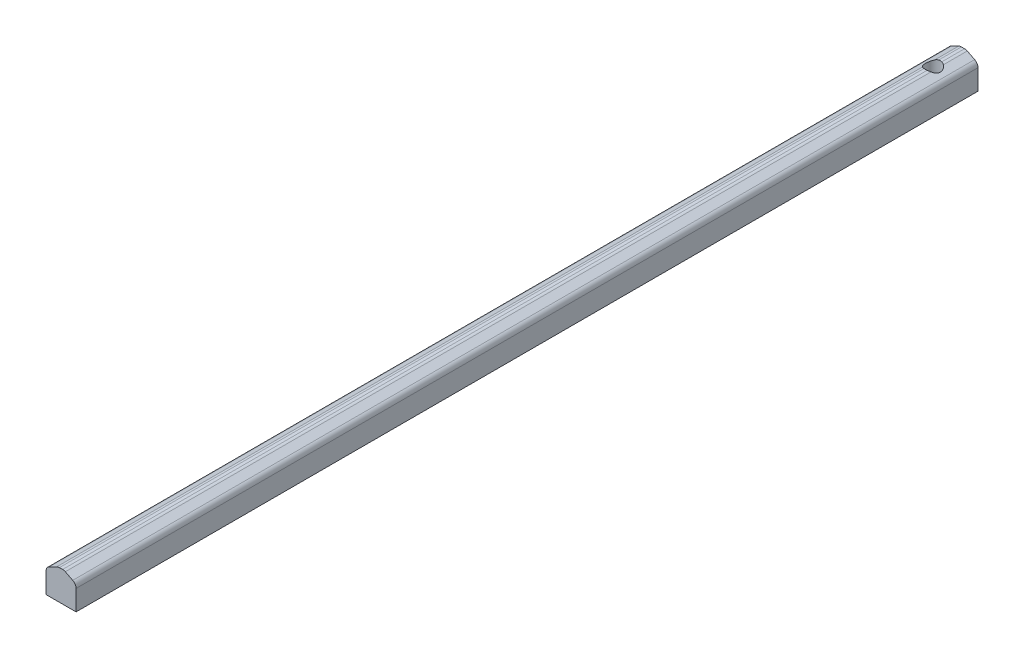
ISO-10303-21;
HEADER;
FILE_DESCRIPTION(('STEP AP214'),'2;1');
FILE_NAME('part.step','',(''),(''),'','','');
FILE_SCHEMA(('AUTOMOTIVE_DESIGN { 1 0 10303 214 1 1 1 1 }'));
ENDSEC;
DATA;
#1=APPLICATION_CONTEXT('core data for automotive mechanical design processes');
#2=APPLICATION_PROTOCOL_DEFINITION('international standard','automotive_design',2000,#1);
#3=PRODUCT_CONTEXT('',#1,'mechanical');
#4=PRODUCT('Part','Part','',(#3));
#5=PRODUCT_RELATED_PRODUCT_CATEGORY('part','',(#4));
#6=PRODUCT_DEFINITION_FORMATION('','',#4);
#7=PRODUCT_DEFINITION_CONTEXT('part definition',#1,'design');
#8=PRODUCT_DEFINITION('design','',#6,#7);
#9=PRODUCT_DEFINITION_SHAPE('','',#8);
#10=(LENGTH_UNIT() NAMED_UNIT(*) SI_UNIT(.MILLI.,.METRE.));
#11=(NAMED_UNIT(*) PLANE_ANGLE_UNIT() SI_UNIT($,.RADIAN.));
#12=(NAMED_UNIT(*) SI_UNIT($,.STERADIAN.) SOLID_ANGLE_UNIT());
#13=UNCERTAINTY_MEASURE_WITH_UNIT(LENGTH_MEASURE(1.E-05),#10,'distance_accuracy_value','');
#14=(GEOMETRIC_REPRESENTATION_CONTEXT(3) GLOBAL_UNCERTAINTY_ASSIGNED_CONTEXT((#13)) GLOBAL_UNIT_ASSIGNED_CONTEXT((#10,
#11,#12)) REPRESENTATION_CONTEXT('',''));
#15=CARTESIAN_POINT('',(0.,0.,0.));
#16=DIRECTION('',(0.,0.,1.));
#17=DIRECTION('',(1.,0.,0.));
#18=AXIS2_PLACEMENT_3D('',#15,#16,#17);
#19=CARTESIAN_POINT('',(0.,10.,300.));
#20=DIRECTION('',(0.,-1.,0.));
#21=DIRECTION('',(0.,0.,-1.));
#22=AXIS2_PLACEMENT_3D('',#19,#20,#21);
#23=PLANE('',#22);
#24=DIRECTION('',(-1.,0.,0.));
#25=VECTOR('',#24,1.);
#26=CARTESIAN_POINT('',(0.,10.,300.));
#27=LINE('',#26,#25);
#28=CARTESIAN_POINT('',(5.52786404500042,10.,300.));
#29=VERTEX_POINT('',#28);
#30=CARTESIAN_POINT('',(4.47213595499958,10.,300.));
#31=VERTEX_POINT('',#30);
#32=EDGE_CURVE('E169',#29,#31,#27,.T.);
#33=ORIENTED_EDGE('',*,*,#32,.F.);
#34=DIRECTION('',(0.,0.,-1.));
#35=VECTOR('',#34,1.);
#36=CARTESIAN_POINT('',(5.52786404500042,10.,300.));
#37=LINE('',#36,#35);
#38=CARTESIAN_POINT('',(5.52786404500042,10.,12.4436365421224));
#39=VERTEX_POINT('',#38);
#40=EDGE_CURVE('E176',#29,#39,#37,.T.);
#41=ORIENTED_EDGE('',*,*,#40,.T.);
#42=CARTESIAN_POINT('',(5.,10.,10.));
#43=DIRECTION('',(0.,1.,0.));
#44=DIRECTION('',(0.,0.,1.));
#45=AXIS2_PLACEMENT_3D('',#42,#43,#44);
#46=CIRCLE('',#45,2.5);
#47=CARTESIAN_POINT('',(4.47213595499958,10.,12.4436365421224));
#48=VERTEX_POINT('',#47);
#49=EDGE_CURVE('E265',#48,#39,#46,.T.);
#50=ORIENTED_EDGE('',*,*,#49,.F.);
#51=DIRECTION('',(0.,0.,-1.));
#52=VECTOR('',#51,1.);
#53=CARTESIAN_POINT('',(4.47213595499958,10.,300.));
#54=LINE('',#53,#52);
#55=EDGE_CURVE('E174',#48,#31,#54,.F.);
#56=ORIENTED_EDGE('',*,*,#55,.T.);
#57=EDGE_LOOP('',(#33,#41,#50,#56));
#58=FACE_BOUND('',#57,.T.);
#59=ADVANCED_FACE('F33',(#58),#23,.F.);
#60=CARTESIAN_POINT('',(0.,0.,300.));
#61=DIRECTION('',(1.,0.,0.));
#62=DIRECTION('',(0.,0.,-1.));
#63=AXIS2_PLACEMENT_3D('',#60,#61,#62);
#64=PLANE('',#63);
#65=DIRECTION('',(0.,-1.,0.));
#66=VECTOR('',#65,1.);
#67=CARTESIAN_POINT('',(0.,0.,300.));
#68=LINE('',#67,#66);
#69=CARTESIAN_POINT('',(0.,6.76393202250021,300.));
#70=VERTEX_POINT('',#69);
#71=CARTESIAN_POINT('',(0.,0.,300.));
#72=VERTEX_POINT('',#71);
#73=EDGE_CURVE('E137',#70,#72,#68,.T.);
#74=ORIENTED_EDGE('',*,*,#73,.F.);
#75=DIRECTION('',(0.,0.,-1.));
#76=VECTOR('',#75,1.);
#77=CARTESIAN_POINT('',(0.,6.76393202250021,300.));
#78=LINE('',#77,#76);
#79=CARTESIAN_POINT('',(0.,6.76393202250021,0.));
#80=VERTEX_POINT('',#79);
#81=EDGE_CURVE('E314',#70,#80,#78,.T.);
#82=ORIENTED_EDGE('',*,*,#81,.T.);
#83=DIRECTION('',(0.,-1.,0.));
#84=VECTOR('',#83,1.);
#85=CARTESIAN_POINT('',(0.,0.,0.));
#86=LINE('',#85,#84);
#87=CARTESIAN_POINT('',(0.,0.,0.));
#88=VERTEX_POINT('',#87);
#89=EDGE_CURVE('E163',#80,#88,#86,.T.);
#90=ORIENTED_EDGE('',*,*,#89,.T.);
#91=DIRECTION('',(0.,0.,-1.));
#92=VECTOR('',#91,1.);
#93=CARTESIAN_POINT('',(0.,0.,300.));
#94=LINE('',#93,#92);
#95=EDGE_CURVE('E155',#72,#88,#94,.T.);
#96=ORIENTED_EDGE('',*,*,#95,.F.);
#97=EDGE_LOOP('',(#74,#82,#90,#96));
#98=FACE_BOUND('',#97,.T.);
#99=ADVANCED_FACE('F161',(#98),#64,.F.);
#100=CARTESIAN_POINT('',(0.,0.,300.));
#101=DIRECTION('',(0.,1.,0.));
#102=DIRECTION('',(0.,0.,1.));
#103=AXIS2_PLACEMENT_3D('',#100,#101,#102);
#104=PLANE('',#103);
#105=CARTESIAN_POINT('',(5.,0.,10.));
#106=DIRECTION('',(0.,1.,0.));
#107=DIRECTION('',(0.,0.,1.));
#108=AXIS2_PLACEMENT_3D('',#105,#106,#107);
#109=CIRCLE('',#108,2.5);
#110=CARTESIAN_POINT('',(5.,0.,12.5));
#111=VERTEX_POINT('',#110);
#112=EDGE_CURVE('E291',#111,#111,#109,.T.);
#113=ORIENTED_EDGE('',*,*,#112,.T.);
#114=EDGE_LOOP('',(#113));
#115=FACE_BOUND('',#114,.T.);
#116=DIRECTION('',(1.,0.,0.));
#117=VECTOR('',#116,1.);
#118=CARTESIAN_POINT('',(0.,0.,0.));
#119=LINE('',#118,#117);
#120=CARTESIAN_POINT('',(10.,0.,0.));
#121=VERTEX_POINT('',#120);
#122=EDGE_CURVE('E299',#88,#121,#119,.T.);
#123=ORIENTED_EDGE('',*,*,#122,.T.);
#124=DIRECTION('',(0.,0.,-1.));
#125=VECTOR('',#124,1.);
#126=CARTESIAN_POINT('',(10.,0.,300.));
#127=LINE('',#126,#125);
#128=CARTESIAN_POINT('',(10.,0.,300.));
#129=VERTEX_POINT('',#128);
#130=EDGE_CURVE('E157',#129,#121,#127,.T.);
#131=ORIENTED_EDGE('',*,*,#130,.F.);
#132=DIRECTION('',(1.,0.,0.));
#133=VECTOR('',#132,1.);
#134=CARTESIAN_POINT('',(0.,0.,300.));
#135=LINE('',#134,#133);
#136=EDGE_CURVE('E141',#72,#129,#135,.T.);
#137=ORIENTED_EDGE('',*,*,#136,.F.);
#138=ORIENTED_EDGE('',*,*,#95,.T.);
#139=EDGE_LOOP('',(#123,#131,#137,#138));
#140=FACE_BOUND('',#139,.T.);
#141=ADVANCED_FACE('F154',(#115,#140),#104,.F.);
#142=CARTESIAN_POINT('',(10.,0.,300.));
#143=DIRECTION('',(-1.,0.,0.));
#144=DIRECTION('',(0.,0.,1.));
#145=AXIS2_PLACEMENT_3D('',#142,#143,#144);
#146=PLANE('',#145);
#147=DIRECTION('',(0.,1.,0.));
#148=VECTOR('',#147,1.);
#149=CARTESIAN_POINT('',(10.,0.,0.));
#150=LINE('',#149,#148);
#151=CARTESIAN_POINT('',(10.,6.76393202250021,0.));
#152=VERTEX_POINT('',#151);
#153=EDGE_CURVE('E301',#121,#152,#150,.T.);
#154=ORIENTED_EDGE('',*,*,#153,.T.);
#155=DIRECTION('',(0.,0.,-1.));
#156=VECTOR('',#155,1.);
#157=CARTESIAN_POINT('',(10.,6.76393202250021,300.));
#158=LINE('',#157,#156);
#159=CARTESIAN_POINT('',(10.,6.76393202250021,300.));
#160=VERTEX_POINT('',#159);
#161=EDGE_CURVE('E320',#152,#160,#158,.F.);
#162=ORIENTED_EDGE('',*,*,#161,.T.);
#163=DIRECTION('',(0.,1.,0.));
#164=VECTOR('',#163,1.);
#165=CARTESIAN_POINT('',(10.,0.,300.));
#166=LINE('',#165,#164);
#167=EDGE_CURVE('E159',#129,#160,#166,.T.);
#168=ORIENTED_EDGE('',*,*,#167,.F.);
#169=ORIENTED_EDGE('',*,*,#130,.T.);
#170=EDGE_LOOP('',(#154,#162,#168,#169));
#171=FACE_BOUND('',#170,.T.);
#172=ADVANCED_FACE('F247',(#171),#146,.F.);
#173=CARTESIAN_POINT('',(5.52786404500042,10.,7.55636345787763));
#174=VERTEX_POINT('',#173);
#175=CARTESIAN_POINT('',(4.47213595499958,10.,7.55636345787763));
#176=VERTEX_POINT('',#175);
#177=EDGE_CURVE('E258',#174,#176,#46,.T.);
#178=ORIENTED_EDGE('',*,*,#177,.F.);
#179=DIRECTION('',(0.,0.,-1.));
#180=VECTOR('',#179,1.);
#181=CARTESIAN_POINT('',(5.52786404500042,10.,300.));
#182=LINE('',#181,#180);
#183=CARTESIAN_POINT('',(5.52786404500042,10.,0.));
#184=VERTEX_POINT('',#183);
#185=EDGE_CURVE('E261',#174,#184,#182,.T.);
#186=ORIENTED_EDGE('',*,*,#185,.T.);
#187=DIRECTION('',(-1.,0.,0.));
#188=VECTOR('',#187,1.);
#189=CARTESIAN_POINT('',(0.,10.,0.));
#190=LINE('',#189,#188);
#191=CARTESIAN_POINT('',(4.47213595499958,10.,0.));
#192=VERTEX_POINT('',#191);
#193=EDGE_CURVE('E150',#184,#192,#190,.T.);
#194=ORIENTED_EDGE('',*,*,#193,.T.);
#195=DIRECTION('',(0.,0.,-1.));
#196=VECTOR('',#195,1.);
#197=CARTESIAN_POINT('',(4.47213595499958,10.,300.));
#198=LINE('',#197,#196);
#199=EDGE_CURVE('E264',#192,#176,#198,.F.);
#200=ORIENTED_EDGE('',*,*,#199,.T.);
#201=EDGE_LOOP('',(#178,#186,#194,#200));
#202=FACE_BOUND('',#201,.T.);
#203=ADVANCED_FACE('F237',(#202),#23,.F.);
#204=CARTESIAN_POINT('',(0.,0.,300.));
#205=DIRECTION('',(0.,0.,-1.));
#206=DIRECTION('',(-1.,0.,0.));
#207=AXIS2_PLACEMENT_3D('',#204,#205,#206);
#208=PLANE('',#207);
#209=ORIENTED_EDGE('',*,*,#167,.T.);
#210=CARTESIAN_POINT('',(8.,6.76393202250021,300.));
#211=DIRECTION('',(0.,0.,-1.));
#212=DIRECTION('',(-1.,0.,0.));
#213=AXIS2_PLACEMENT_3D('',#210,#211,#212);
#214=CIRCLE('',#213,2.);
#215=CARTESIAN_POINT('',(8.89442719099991,8.55278640450004,300.));
#216=VERTEX_POINT('',#215);
#217=EDGE_CURVE('E315',#160,#216,#214,.F.);
#218=ORIENTED_EDGE('',*,*,#217,.T.);
#219=DIRECTION('',(-0.894427190999916,0.447213595499958,0.));
#220=VECTOR('',#219,1.);
#221=CARTESIAN_POINT('',(10.,8.,300.));
#222=LINE('',#221,#220);
#223=CARTESIAN_POINT('',(6.42229123600034,9.78885438199983,300.));
#224=VERTEX_POINT('',#223);
#225=EDGE_CURVE('E284',#216,#224,#222,.T.);
#226=ORIENTED_EDGE('',*,*,#225,.T.);
#227=CARTESIAN_POINT('',(5.52786404500042,8.,300.));
#228=DIRECTION('',(0.,0.,-1.));
#229=DIRECTION('',(-1.,0.,0.));
#230=AXIS2_PLACEMENT_3D('',#227,#228,#229);
#231=CIRCLE('',#230,2.);
#232=EDGE_CURVE('E326',#224,#29,#231,.F.);
#233=ORIENTED_EDGE('',*,*,#232,.T.);
#234=ORIENTED_EDGE('',*,*,#32,.T.);
#235=CARTESIAN_POINT('',(4.47213595499958,8.,300.));
#236=DIRECTION('',(0.,0.,-1.));
#237=DIRECTION('',(-1.,0.,0.));
#238=AXIS2_PLACEMENT_3D('',#235,#236,#237);
#239=CIRCLE('',#238,2.);
#240=CARTESIAN_POINT('',(3.57770876399966,9.78885438199983,300.));
#241=VERTEX_POINT('',#240);
#242=EDGE_CURVE('E328',#31,#241,#239,.F.);
#243=ORIENTED_EDGE('',*,*,#242,.T.);
#244=DIRECTION('',(-0.894427190999916,-0.447213595499958,0.));
#245=VECTOR('',#244,1.);
#246=CARTESIAN_POINT('',(4.,10.,300.));
#247=LINE('',#246,#245);
#248=CARTESIAN_POINT('',(1.10557280900008,8.55278640450004,300.));
#249=VERTEX_POINT('',#248);
#250=EDGE_CURVE('E266',#241,#249,#247,.T.);
#251=ORIENTED_EDGE('',*,*,#250,.T.);
#252=CARTESIAN_POINT('',(2.,6.76393202250021,300.));
#253=DIRECTION('',(0.,0.,-1.));
#254=DIRECTION('',(-1.,0.,0.));
#255=AXIS2_PLACEMENT_3D('',#252,#253,#254);
#256=CIRCLE('',#255,2.);
#257=EDGE_CURVE('E145',#249,#70,#256,.F.);
#258=ORIENTED_EDGE('',*,*,#257,.T.);
#259=ORIENTED_EDGE('',*,*,#73,.T.);
#260=ORIENTED_EDGE('',*,*,#136,.T.);
#261=EDGE_LOOP('',(#209,#218,#226,#233,#234,#243,#251,#258,#259,#260));
#262=FACE_BOUND('',#261,.T.);
#263=ADVANCED_FACE('F140',(#262),#208,.F.);
#264=CARTESIAN_POINT('',(0.,0.,0.));
#265=DIRECTION('',(0.,0.,-1.));
#266=DIRECTION('',(-1.,0.,0.));
#267=AXIS2_PLACEMENT_3D('',#264,#265,#266);
#268=PLANE('',#267);
#269=ORIENTED_EDGE('',*,*,#193,.F.);
#270=CARTESIAN_POINT('',(5.52786404500042,8.,0.));
#271=DIRECTION('',(0.,0.,-1.));
#272=DIRECTION('',(-1.,0.,0.));
#273=AXIS2_PLACEMENT_3D('',#270,#271,#272);
#274=CIRCLE('',#273,2.);
#275=CARTESIAN_POINT('',(6.42229123600034,9.78885438199983,0.));
#276=VERTEX_POINT('',#275);
#277=EDGE_CURVE('E269',#184,#276,#274,.T.);
#278=ORIENTED_EDGE('',*,*,#277,.T.);
#279=DIRECTION('',(-0.894427190999916,0.447213595499958,0.));
#280=VECTOR('',#279,1.);
#281=CARTESIAN_POINT('',(10.,8.,0.));
#282=LINE('',#281,#280);
#283=CARTESIAN_POINT('',(8.89442719099991,8.55278640450004,0.));
#284=VERTEX_POINT('',#283);
#285=EDGE_CURVE('E278',#284,#276,#282,.T.);
#286=ORIENTED_EDGE('',*,*,#285,.F.);
#287=CARTESIAN_POINT('',(8.,6.76393202250021,0.));
#288=DIRECTION('',(0.,0.,-1.));
#289=DIRECTION('',(-1.,0.,0.));
#290=AXIS2_PLACEMENT_3D('',#287,#288,#289);
#291=CIRCLE('',#290,2.);
#292=EDGE_CURVE('E311',#284,#152,#291,.T.);
#293=ORIENTED_EDGE('',*,*,#292,.T.);
#294=ORIENTED_EDGE('',*,*,#153,.F.);
#295=ORIENTED_EDGE('',*,*,#122,.F.);
#296=ORIENTED_EDGE('',*,*,#89,.F.);
#297=CARTESIAN_POINT('',(2.,6.76393202250021,0.));
#298=DIRECTION('',(0.,0.,-1.));
#299=DIRECTION('',(-1.,0.,0.));
#300=AXIS2_PLACEMENT_3D('',#297,#298,#299);
#301=CIRCLE('',#300,2.);
#302=CARTESIAN_POINT('',(1.10557280900008,8.55278640450004,0.));
#303=VERTEX_POINT('',#302);
#304=EDGE_CURVE('E309',#80,#303,#301,.T.);
#305=ORIENTED_EDGE('',*,*,#304,.T.);
#306=DIRECTION('',(-0.894427190999916,-0.447213595499958,0.));
#307=VECTOR('',#306,1.);
#308=CARTESIAN_POINT('',(4.,10.,0.));
#309=LINE('',#308,#307);
#310=CARTESIAN_POINT('',(3.57770876399966,9.78885438199983,0.));
#311=VERTEX_POINT('',#310);
#312=EDGE_CURVE('E286',#311,#303,#309,.T.);
#313=ORIENTED_EDGE('',*,*,#312,.F.);
#314=CARTESIAN_POINT('',(4.47213595499958,8.,0.));
#315=DIRECTION('',(0.,0.,-1.));
#316=DIRECTION('',(-1.,0.,0.));
#317=AXIS2_PLACEMENT_3D('',#314,#315,#316);
#318=CIRCLE('',#317,2.);
#319=EDGE_CURVE('E270',#311,#192,#318,.T.);
#320=ORIENTED_EDGE('',*,*,#319,.T.);
#321=EDGE_LOOP('',(#269,#278,#286,#293,#294,#295,#296,#305,#313,#320));
#322=FACE_BOUND('',#321,.T.);
#323=ADVANCED_FACE('F201',(#322),#268,.T.);
#324=CARTESIAN_POINT('',(5.,0.,10.));
#325=DIRECTION('',(0.,1.,0.));
#326=DIRECTION('',(0.,0.,1.));
#327=AXIS2_PLACEMENT_3D('',#324,#325,#326);
#328=CYLINDRICAL_SURFACE('',#327,2.5);
#329=ORIENTED_EDGE('',*,*,#112,.F.);
#330=EDGE_LOOP('',(#329));
#331=FACE_BOUND('',#330,.T.);
#332=CARTESIAN_POINT('',(5.,10.5,10.));
#333=DIRECTION('',(-0.447213595499958,-0.894427190999916,0.));
#334=DIRECTION('',(-0.894427190999916,0.447213595499958,0.));
#335=AXIS2_PLACEMENT_3D('',#332,#333,#334);
#336=ELLIPSE('',#335,2.79508497187474,2.5);
#337=CARTESIAN_POINT('',(6.42229123600034,9.78885438199983,12.0559882392653));
#338=VERTEX_POINT('',#337);
#339=CARTESIAN_POINT('',(6.42229123600034,9.78885438199983,7.94401176073485));
#340=VERTEX_POINT('',#339);
#341=EDGE_CURVE('E167',#338,#340,#336,.F.);
#342=ORIENTED_EDGE('',*,*,#341,.T.);
#343=CARTESIAN_POINT('',(6.42229123600034,9.78885438199983,7.94401176073485));
#344=CARTESIAN_POINT('',(6.38226954163994,9.80885974923343,7.91632954531952));
#345=CARTESIAN_POINT('',(6.34108623589351,9.82777595224518,7.88956584852165));
#346=CARTESIAN_POINT('',(6.2563825366894,9.86316372439763,7.8380629124035));
#347=CARTESIAN_POINT('',(6.21285903551435,9.87963192773385,7.81332648098554));
#348=CARTESIAN_POINT('',(6.08112444446555,9.92414316639597,7.74371171818515));
#349=CARTESIAN_POINT('',(5.98976891346898,9.94830479885139,7.70204356486413));
#350=CARTESIAN_POINT('',(5.8364935108827,9.97694702591601,7.64325651748176));
#351=CARTESIAN_POINT('',(5.77655060397731,9.98541649743705,7.62282059844309));
#352=CARTESIAN_POINT('',(5.65391919741796,9.99699105054667,7.58617139695071));
#353=CARTESIAN_POINT('',(5.59120326385613,10.0000152924204,7.57002473474417));
#354=CARTESIAN_POINT('',(5.52786404500042,10.,7.55636345787763));
#355=B_SPLINE_CURVE_WITH_KNOTS('',3,(#343,#344,#345,#346,#347,#348,#349,#350,#351,#352,#353,
#354),.UNSPECIFIED.,.F.,.F.,(4,2,2,2,2,4),(0.,0.157771751958216,0.315758460007223,
0.623952186611269,0.815257866779008,1.00938095500679),.UNSPECIFIED.);
#356=EDGE_CURVE('E42',#340,#174,#355,.T.);
#357=ORIENTED_EDGE('',*,*,#356,.T.);
#358=ORIENTED_EDGE('',*,*,#177,.T.);
#359=CARTESIAN_POINT('',(4.47213595499958,10.,7.55636345787763));
#360=CARTESIAN_POINT('',(4.42075728936102,10.0000109177209,7.5674485912628));
#361=CARTESIAN_POINT('',(4.36975447484512,9.99802093634849,7.5801746644326));
#362=CARTESIAN_POINT('',(4.26895453841058,9.99029090479403,7.60870416843121));
#363=CARTESIAN_POINT('',(4.21915634673232,9.98455431882345,7.62450474702369));
#364=CARTESIAN_POINT('',(4.1221897265318,9.96974478711243,7.65862466050524));
#365=CARTESIAN_POINT('',(4.07498765499996,9.96074714664832,7.67688171481629));
#366=CARTESIAN_POINT('',(3.98236228029639,9.93968480522951,7.71593794074403));
#367=CARTESIAN_POINT('',(3.93693892611729,9.92762019229925,7.73673703939322));
#368=CARTESIAN_POINT('',(3.83712990550918,9.8973968554699,7.78605640114764));
#369=CARTESIAN_POINT('',(3.78329399268073,9.87846901788279,7.81521633137743));
#370=CARTESIAN_POINT('',(3.67822837238375,9.83656187761328,7.87710072261574));
#371=CARTESIAN_POINT('',(3.62704568263801,9.81352958224702,7.90986935768421));
#372=CARTESIAN_POINT('',(3.57770876399966,9.78885438199983,7.94401176073485));
#373=B_SPLINE_CURVE_WITH_KNOTS('',3,(#359,#360,#361,#362,#363,#364,#365,#366,#367,#368,#369,
#370,#371,#372),.UNSPECIFIED.,.F.,.F.,(4,2,2,2,2,2,4),(0.,0.15758724265989,0.315028981804846,
0.469045235300577,0.623057068911241,0.815020642991488,1.00967072748091),.UNSPECIFIED.);
#374=CARTESIAN_POINT('',(3.57770876399966,9.78885438199983,7.94401176073485));
#375=VERTEX_POINT('',#374);
#376=EDGE_CURVE('E49',#176,#375,#373,.T.);
#377=ORIENTED_EDGE('',*,*,#376,.T.);
#378=CARTESIAN_POINT('',(5.,10.5,10.));
#379=DIRECTION('',(0.447213595499958,-0.894427190999916,0.));
#380=DIRECTION('',(0.894427190999916,0.447213595499958,0.));
#381=AXIS2_PLACEMENT_3D('',#378,#379,#380);
#382=ELLIPSE('',#381,2.79508497187474,2.5);
#383=CARTESIAN_POINT('',(3.57770876399966,9.78885438199983,12.0559882392652));
#384=VERTEX_POINT('',#383);
#385=EDGE_CURVE('E165',#375,#384,#382,.F.);
#386=ORIENTED_EDGE('',*,*,#385,.T.);
#387=CARTESIAN_POINT('',(3.57770876399966,9.78885438199983,12.0559882392652));
#388=CARTESIAN_POINT('',(3.61773045836007,9.80885974923343,12.0836704546805));
#389=CARTESIAN_POINT('',(3.65891376410649,9.82777595224518,12.1104341514784));
#390=CARTESIAN_POINT('',(3.74361746331061,9.86316372439763,12.1619370875965));
#391=CARTESIAN_POINT('',(3.78714096448565,9.87963192773385,12.1866735190145));
#392=CARTESIAN_POINT('',(3.91887555553445,9.92414316639597,12.2562882818149));
#393=CARTESIAN_POINT('',(4.01023108653102,9.94830479885139,12.2979564351359));
#394=CARTESIAN_POINT('',(4.1635064891173,9.97694702591601,12.3567434825183));
#395=CARTESIAN_POINT('',(4.22344939602269,9.98541649743705,12.3771794015569));
#396=CARTESIAN_POINT('',(4.34608080258205,9.99699105054667,12.4138286030493));
#397=CARTESIAN_POINT('',(4.40879673614387,10.0000152924204,12.4299752652558));
#398=CARTESIAN_POINT('',(4.47213595499958,10.,12.4436365421224));
#399=B_SPLINE_CURVE_WITH_KNOTS('',3,(#387,#388,#389,#390,#391,#392,#393,#394,#395,#396,#397,
#398),.UNSPECIFIED.,.F.,.F.,(4,2,2,2,2,4),(0.,0.157771751958216,0.315758460007223,
0.62395218661127,0.815257866779009,1.00938095500679),.UNSPECIFIED.);
#400=EDGE_CURVE('E179',#384,#48,#399,.T.);
#401=ORIENTED_EDGE('',*,*,#400,.T.);
#402=ORIENTED_EDGE('',*,*,#49,.T.);
#403=CARTESIAN_POINT('',(5.52786404500042,10.,12.4436365421224));
#404=CARTESIAN_POINT('',(5.57924271063899,10.0000109177209,12.4325514087372));
#405=CARTESIAN_POINT('',(5.63024552515488,9.99802093634849,12.4198253355674));
#406=CARTESIAN_POINT('',(5.73104546158942,9.99029090479403,12.3912958315688));
#407=CARTESIAN_POINT('',(5.78084365326768,9.98455431882346,12.3754952529763));
#408=CARTESIAN_POINT('',(5.8778102734682,9.96974478711243,12.3413753394948));
#409=CARTESIAN_POINT('',(5.92501234500004,9.96074714664832,12.3231182851837));
#410=CARTESIAN_POINT('',(6.01763771970361,9.93968480522951,12.284062059256));
#411=CARTESIAN_POINT('',(6.06306107388271,9.92762019229925,12.2632629606068));
#412=CARTESIAN_POINT('',(6.16287009449082,9.8973968554699,12.2139435988524));
#413=CARTESIAN_POINT('',(6.21670600731927,9.8784690178828,12.1847836686226));
#414=CARTESIAN_POINT('',(6.32177162761625,9.83656187761328,12.1228992773843));
#415=CARTESIAN_POINT('',(6.372954317362,9.81352958224702,12.0901306423158));
#416=CARTESIAN_POINT('',(6.42229123600034,9.78885438199983,12.0559882392652));
#417=B_SPLINE_CURVE_WITH_KNOTS('',3,(#403,#404,#405,#406,#407,#408,#409,#410,#411,#412,#413,
#414,#415,#416),.UNSPECIFIED.,.F.,.F.,(4,2,2,2,2,2,4),(0.,0.157587242659889,0.315028981804845,
0.469045235300576,0.623057068911241,0.815020642991487,1.00967072748091),.UNSPECIFIED.);
#418=EDGE_CURVE('E186',#39,#338,#417,.T.);
#419=ORIENTED_EDGE('',*,*,#418,.T.);
#420=EDGE_LOOP('',(#342,#357,#358,#377,#386,#401,#402,#419));
#421=FACE_BOUND('',#420,.T.);
#422=ADVANCED_FACE('F195',(#331,#421),#328,.F.);
#423=CARTESIAN_POINT('',(4.,10.,300.));
#424=DIRECTION('',(0.447213595499958,-0.894427190999916,0.));
#425=DIRECTION('',(0.894427190999916,0.447213595499958,0.));
#426=AXIS2_PLACEMENT_3D('',#423,#424,#425);
#427=PLANE('',#426);
#428=ORIENTED_EDGE('',*,*,#385,.F.);
#429=DIRECTION('',(0.,0.,-1.));
#430=VECTOR('',#429,1.);
#431=CARTESIAN_POINT('',(3.57770876399966,9.78885438199983,300.));
#432=LINE('',#431,#430);
#433=EDGE_CURVE('E11',#375,#311,#432,.T.);
#434=ORIENTED_EDGE('',*,*,#433,.T.);
#435=ORIENTED_EDGE('',*,*,#312,.T.);
#436=DIRECTION('',(0.,0.,-1.));
#437=VECTOR('',#436,1.);
#438=CARTESIAN_POINT('',(1.10557280900008,8.55278640450004,300.));
#439=LINE('',#438,#437);
#440=EDGE_CURVE('E273',#303,#249,#439,.F.);
#441=ORIENTED_EDGE('',*,*,#440,.T.);
#442=ORIENTED_EDGE('',*,*,#250,.F.);
#443=DIRECTION('',(0.,0.,-1.));
#444=VECTOR('',#443,1.);
#445=CARTESIAN_POINT('',(3.57770876399966,9.78885438199983,300.));
#446=LINE('',#445,#444);
#447=EDGE_CURVE('E324',#241,#384,#446,.T.);
#448=ORIENTED_EDGE('',*,*,#447,.T.);
#449=EDGE_LOOP('',(#428,#434,#435,#441,#442,#448));
#450=FACE_BOUND('',#449,.T.);
#451=ADVANCED_FACE('F200',(#450),#427,.F.);
#452=CARTESIAN_POINT('',(10.,8.,300.));
#453=DIRECTION('',(-0.447213595499958,-0.894427190999916,0.));
#454=DIRECTION('',(0.894427190999916,-0.447213595499958,0.));
#455=AXIS2_PLACEMENT_3D('',#452,#453,#454);
#456=PLANE('',#455);
#457=ORIENTED_EDGE('',*,*,#285,.T.);
#458=DIRECTION('',(0.,0.,-1.));
#459=VECTOR('',#458,1.);
#460=CARTESIAN_POINT('',(6.42229123600034,9.78885438199983,300.));
#461=LINE('',#460,#459);
#462=EDGE_CURVE('E57',#276,#340,#461,.F.);
#463=ORIENTED_EDGE('',*,*,#462,.T.);
#464=ORIENTED_EDGE('',*,*,#341,.F.);
#465=DIRECTION('',(0.,0.,-1.));
#466=VECTOR('',#465,1.);
#467=CARTESIAN_POINT('',(6.42229123600034,9.78885438199983,300.));
#468=LINE('',#467,#466);
#469=EDGE_CURVE('E329',#338,#224,#468,.F.);
#470=ORIENTED_EDGE('',*,*,#469,.T.);
#471=ORIENTED_EDGE('',*,*,#225,.F.);
#472=DIRECTION('',(0.,0.,-1.));
#473=VECTOR('',#472,1.);
#474=CARTESIAN_POINT('',(8.89442719099991,8.55278640450004,300.));
#475=LINE('',#474,#473);
#476=EDGE_CURVE('E283',#216,#284,#475,.T.);
#477=ORIENTED_EDGE('',*,*,#476,.T.);
#478=EDGE_LOOP('',(#457,#463,#464,#470,#471,#477));
#479=FACE_BOUND('',#478,.T.);
#480=ADVANCED_FACE('F280',(#479),#456,.F.);
#481=CARTESIAN_POINT('',(5.52786404500042,8.,300.));
#482=DIRECTION('',(0.,0.,-1.));
#483=DIRECTION('',(-1.,0.,0.));
#484=AXIS2_PLACEMENT_3D('',#481,#482,#483);
#485=CYLINDRICAL_SURFACE('',#484,2.);
#486=ORIENTED_EDGE('',*,*,#232,.F.);
#487=ORIENTED_EDGE('',*,*,#469,.F.);
#488=ORIENTED_EDGE('',*,*,#418,.F.);
#489=ORIENTED_EDGE('',*,*,#40,.F.);
#490=EDGE_LOOP('',(#486,#487,#488,#489));
#491=FACE_BOUND('',#490,.T.);
#492=ADVANCED_FACE('F231',(#491),#485,.T.);
#493=CARTESIAN_POINT('',(4.47213595499958,8.,300.));
#494=DIRECTION('',(0.,0.,-1.));
#495=DIRECTION('',(-1.,0.,0.));
#496=AXIS2_PLACEMENT_3D('',#493,#494,#495);
#497=CYLINDRICAL_SURFACE('',#496,2.);
#498=ORIENTED_EDGE('',*,*,#242,.F.);
#499=ORIENTED_EDGE('',*,*,#55,.F.);
#500=ORIENTED_EDGE('',*,*,#400,.F.);
#501=ORIENTED_EDGE('',*,*,#447,.F.);
#502=EDGE_LOOP('',(#498,#499,#500,#501));
#503=FACE_BOUND('',#502,.T.);
#504=ADVANCED_FACE('F192',(#503),#497,.T.);
#505=CARTESIAN_POINT('',(8.,6.76393202250021,300.));
#506=DIRECTION('',(0.,0.,-1.));
#507=DIRECTION('',(-1.,0.,0.));
#508=AXIS2_PLACEMENT_3D('',#505,#506,#507);
#509=CYLINDRICAL_SURFACE('',#508,2.);
#510=ORIENTED_EDGE('',*,*,#217,.F.);
#511=ORIENTED_EDGE('',*,*,#161,.F.);
#512=ORIENTED_EDGE('',*,*,#292,.F.);
#513=ORIENTED_EDGE('',*,*,#476,.F.);
#514=EDGE_LOOP('',(#510,#511,#512,#513));
#515=FACE_BOUND('',#514,.T.);
#516=ADVANCED_FACE('F224',(#515),#509,.T.);
#517=CARTESIAN_POINT('',(2.,6.76393202250021,300.));
#518=DIRECTION('',(0.,0.,-1.));
#519=DIRECTION('',(-1.,0.,0.));
#520=AXIS2_PLACEMENT_3D('',#517,#518,#519);
#521=CYLINDRICAL_SURFACE('',#520,2.);
#522=ORIENTED_EDGE('',*,*,#257,.F.);
#523=ORIENTED_EDGE('',*,*,#440,.F.);
#524=ORIENTED_EDGE('',*,*,#304,.F.);
#525=ORIENTED_EDGE('',*,*,#81,.F.);
#526=EDGE_LOOP('',(#522,#523,#524,#525));
#527=FACE_BOUND('',#526,.T.);
#528=ADVANCED_FACE('F221',(#527),#521,.T.);
#529=CARTESIAN_POINT('',(5.52786404500042,8.,300.));
#530=DIRECTION('',(0.,0.,-1.));
#531=DIRECTION('',(-1.,0.,0.));
#532=AXIS2_PLACEMENT_3D('',#529,#530,#531);
#533=CYLINDRICAL_SURFACE('',#532,2.);
#534=ORIENTED_EDGE('',*,*,#356,.F.);
#535=ORIENTED_EDGE('',*,*,#462,.F.);
#536=ORIENTED_EDGE('',*,*,#277,.F.);
#537=ORIENTED_EDGE('',*,*,#185,.F.);
#538=EDGE_LOOP('',(#534,#535,#536,#537));
#539=FACE_BOUND('',#538,.T.);
#540=ADVANCED_FACE('F217',(#539),#533,.T.);
#541=CARTESIAN_POINT('',(4.47213595499958,8.,300.));
#542=DIRECTION('',(0.,0.,-1.));
#543=DIRECTION('',(-1.,0.,0.));
#544=AXIS2_PLACEMENT_3D('',#541,#542,#543);
#545=CYLINDRICAL_SURFACE('',#544,2.);
#546=ORIENTED_EDGE('',*,*,#376,.F.);
#547=ORIENTED_EDGE('',*,*,#199,.F.);
#548=ORIENTED_EDGE('',*,*,#319,.F.);
#549=ORIENTED_EDGE('',*,*,#433,.F.);
#550=EDGE_LOOP('',(#546,#547,#548,#549));
#551=FACE_BOUND('',#550,.T.);
#552=ADVANCED_FACE('F35',(#551),#545,.T.);
#553=CLOSED_SHELL('',(#59,#99,#141,#172,#203,#263,#323,#422,#451,#480,#492,#504,#516,#528,#540,#552));
#554=MANIFOLD_SOLID_BREP('B2',#553);
#555=ADVANCED_BREP_SHAPE_REPRESENTATION('',(#18,#554),#14);
#556=SHAPE_DEFINITION_REPRESENTATION(#9,#555);
ENDSEC;
END-ISO-10303-21;
